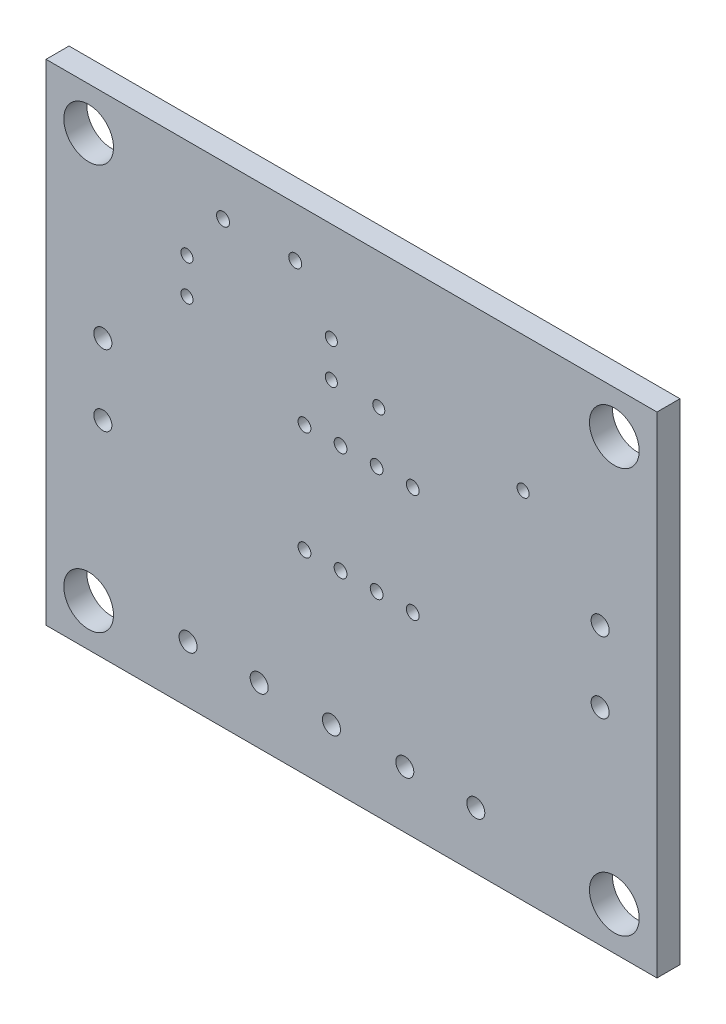
ISO-10303-21;
HEADER;
FILE_DESCRIPTION(('STEP AP214'),'2;1');
FILE_NAME('part.step','',(''),(''),'','','');
FILE_SCHEMA(('AUTOMOTIVE_DESIGN { 1 0 10303 214 1 1 1 1 }'));
ENDSEC;
DATA;
#1=APPLICATION_CONTEXT('core data for automotive mechanical design processes');
#2=APPLICATION_PROTOCOL_DEFINITION('international standard','automotive_design',2000,#1);
#3=PRODUCT_CONTEXT('',#1,'mechanical');
#4=PRODUCT('Part','Part','',(#3));
#5=PRODUCT_RELATED_PRODUCT_CATEGORY('part','',(#4));
#6=PRODUCT_DEFINITION_FORMATION('','',#4);
#7=PRODUCT_DEFINITION_CONTEXT('part definition',#1,'design');
#8=PRODUCT_DEFINITION('design','',#6,#7);
#9=PRODUCT_DEFINITION_SHAPE('','',#8);
#10=(LENGTH_UNIT() NAMED_UNIT(*) SI_UNIT(.MILLI.,.METRE.));
#11=(NAMED_UNIT(*) PLANE_ANGLE_UNIT() SI_UNIT($,.RADIAN.));
#12=(NAMED_UNIT(*) SI_UNIT($,.STERADIAN.) SOLID_ANGLE_UNIT());
#13=UNCERTAINTY_MEASURE_WITH_UNIT(LENGTH_MEASURE(1.E-05),#10,'distance_accuracy_value','');
#14=(GEOMETRIC_REPRESENTATION_CONTEXT(3) GLOBAL_UNCERTAINTY_ASSIGNED_CONTEXT((#13)) GLOBAL_UNIT_ASSIGNED_CONTEXT((#10,
#11,#12)) REPRESENTATION_CONTEXT('',''));
#15=CARTESIAN_POINT('',(0.,0.,0.));
#16=DIRECTION('',(0.,0.,1.));
#17=DIRECTION('',(1.,0.,0.));
#18=AXIS2_PLACEMENT_3D('',#15,#16,#17);
#19=CARTESIAN_POINT('',(0.,0.,0.));
#20=DIRECTION('',(0.,0.,-1.));
#21=DIRECTION('',(-1.,0.,0.));
#22=AXIS2_PLACEMENT_3D('',#19,#20,#21);
#23=PLANE('',#22);
#24=CARTESIAN_POINT('',(40.00000128,31.5000005,0.));
#25=DIRECTION('',(0.,0.,-1.));
#26=DIRECTION('',(-1.,0.,0.));
#27=AXIS2_PLACEMENT_3D('',#24,#25,#26);
#28=CIRCLE('',#27,1.74999904);
#29=CARTESIAN_POINT('',(38.25000224,31.5000005,0.));
#30=VERTEX_POINT('',#29);
#31=EDGE_CURVE('E163',#30,#30,#28,.F.);
#32=ORIENTED_EDGE('',*,*,#31,.T.);
#33=EDGE_LOOP('',(#32));
#34=FACE_BOUND('',#33,.T.);
#35=CARTESIAN_POINT('',(33.57999888,25.0000008,0.));
#36=DIRECTION('',(0.,0.,-1.));
#37=DIRECTION('',(-1.,0.,0.));
#38=AXIS2_PLACEMENT_3D('',#35,#36,#37);
#39=CIRCLE('',#38,0.42500042);
#40=CARTESIAN_POINT('',(33.15499846,25.0000008,0.));
#41=VERTEX_POINT('',#40);
#42=EDGE_CURVE('E166',#41,#41,#39,.F.);
#43=ORIENTED_EDGE('',*,*,#42,.T.);
#44=EDGE_LOOP('',(#43));
#45=FACE_BOUND('',#44,.T.);
#46=CARTESIAN_POINT('',(39.00000074,19.4999991,0.));
#47=DIRECTION('',(0.,0.,-1.));
#48=DIRECTION('',(-1.,0.,0.));
#49=AXIS2_PLACEMENT_3D('',#46,#47,#48);
#50=CIRCLE('',#49,0.635);
#51=CARTESIAN_POINT('',(38.36500074,19.4999991,0.));
#52=VERTEX_POINT('',#51);
#53=EDGE_CURVE('E169',#52,#52,#50,.F.);
#54=ORIENTED_EDGE('',*,*,#53,.T.);
#55=EDGE_LOOP('',(#54));
#56=FACE_BOUND('',#55,.T.);
#57=CARTESIAN_POINT('',(25.80999918,21.31000056,0.));
#58=DIRECTION('',(0.,0.,-1.));
#59=DIRECTION('',(-1.,0.,0.));
#60=AXIS2_PLACEMENT_3D('',#57,#58,#59);
#61=CIRCLE('',#60,0.4499991);
#62=CARTESIAN_POINT('',(25.36000008,21.31000056,0.));
#63=VERTEX_POINT('',#62);
#64=EDGE_CURVE('E172',#63,#63,#61,.F.);
#65=ORIENTED_EDGE('',*,*,#64,.T.);
#66=EDGE_LOOP('',(#65));
#67=FACE_BOUND('',#66,.T.);
#68=CARTESIAN_POINT('',(23.41999888,25.0000008,0.));
#69=DIRECTION('',(0.,0.,-1.));
#70=DIRECTION('',(-1.,0.,0.));
#71=AXIS2_PLACEMENT_3D('',#68,#69,#70);
#72=CIRCLE('',#71,0.42500042);
#73=CARTESIAN_POINT('',(22.99499846,25.0000008,0.));
#74=VERTEX_POINT('',#73);
#75=EDGE_CURVE('E175',#74,#74,#72,.F.);
#76=ORIENTED_EDGE('',*,*,#75,.T.);
#77=EDGE_LOOP('',(#76));
#78=FACE_BOUND('',#77,.T.);
#79=CARTESIAN_POINT('',(20.08000048,25.0000008,0.));
#80=DIRECTION('',(0.,0.,-1.));
#81=DIRECTION('',(-1.,0.,0.));
#82=AXIS2_PLACEMENT_3D('',#79,#80,#81);
#83=CIRCLE('',#82,0.42500042);
#84=CARTESIAN_POINT('',(19.65500006,25.0000008,0.));
#85=VERTEX_POINT('',#84);
#86=EDGE_CURVE('E178',#85,#85,#83,.F.);
#87=ORIENTED_EDGE('',*,*,#86,.T.);
#88=EDGE_LOOP('',(#87));
#89=FACE_BOUND('',#88,.T.);
#90=CARTESIAN_POINT('',(23.26999918,21.31000056,0.));
#91=DIRECTION('',(0.,0.,-1.));
#92=DIRECTION('',(-1.,0.,0.));
#93=AXIS2_PLACEMENT_3D('',#90,#91,#92);
#94=CIRCLE('',#93,0.4499991);
#95=CARTESIAN_POINT('',(22.82000008,21.31000056,0.));
#96=VERTEX_POINT('',#95);
#97=EDGE_CURVE('E181',#96,#96,#94,.F.);
#98=ORIENTED_EDGE('',*,*,#97,.T.);
#99=EDGE_LOOP('',(#98));
#100=FACE_BOUND('',#99,.T.);
#101=CARTESIAN_POINT('',(20.72999918,21.31000056,0.));
#102=DIRECTION('',(0.,0.,-1.));
#103=DIRECTION('',(-1.,0.,0.));
#104=AXIS2_PLACEMENT_3D('',#101,#102,#103);
#105=CIRCLE('',#104,0.4499991);
#106=CARTESIAN_POINT('',(20.28000008,21.31000056,0.));
#107=VERTEX_POINT('',#106);
#108=EDGE_CURVE('E184',#107,#107,#105,.F.);
#109=ORIENTED_EDGE('',*,*,#108,.T.);
#110=EDGE_LOOP('',(#109));
#111=FACE_BOUND('',#110,.T.);
#112=CARTESIAN_POINT('',(39.00000074,14.5000091,0.));
#113=DIRECTION('',(0.,0.,-1.));
#114=DIRECTION('',(-1.,0.,0.));
#115=AXIS2_PLACEMENT_3D('',#112,#113,#114);
#116=CIRCLE('',#115,0.635);
#117=CARTESIAN_POINT('',(38.36500074,14.5000091,0.));
#118=VERTEX_POINT('',#117);
#119=EDGE_CURVE('E187',#118,#118,#116,.F.);
#120=ORIENTED_EDGE('',*,*,#119,.T.);
#121=EDGE_LOOP('',(#120));
#122=FACE_BOUND('',#121,.T.);
#123=CARTESIAN_POINT('',(25.80999918,13.69000056,0.));
#124=DIRECTION('',(0.,0.,-1.));
#125=DIRECTION('',(-1.,0.,0.));
#126=AXIS2_PLACEMENT_3D('',#123,#124,#125);
#127=CIRCLE('',#126,0.4499991);
#128=CARTESIAN_POINT('',(25.36000008,13.69000056,0.));
#129=VERTEX_POINT('',#128);
#130=EDGE_CURVE('E190',#129,#129,#127,.F.);
#131=ORIENTED_EDGE('',*,*,#130,.T.);
#132=EDGE_LOOP('',(#131));
#133=FACE_BOUND('',#132,.T.);
#134=CARTESIAN_POINT('',(40.00000128,2.99999908,0.));
#135=DIRECTION('',(0.,0.,-1.));
#136=DIRECTION('',(-1.,0.,0.));
#137=AXIS2_PLACEMENT_3D('',#134,#135,#136);
#138=CIRCLE('',#137,1.74999904);
#139=CARTESIAN_POINT('',(38.25000224,2.99999908,0.));
#140=VERTEX_POINT('',#139);
#141=EDGE_CURVE('E193',#140,#140,#138,.F.);
#142=ORIENTED_EDGE('',*,*,#141,.T.);
#143=EDGE_LOOP('',(#142));
#144=FACE_BOUND('',#143,.T.);
#145=CARTESIAN_POINT('',(30.25000046,3.99999962,0.));
#146=DIRECTION('',(0.,0.,-1.));
#147=DIRECTION('',(-1.,0.,0.));
#148=AXIS2_PLACEMENT_3D('',#145,#146,#147);
#149=CIRCLE('',#148,0.635);
#150=CARTESIAN_POINT('',(29.61500046,3.99999962,0.));
#151=VERTEX_POINT('',#150);
#152=EDGE_CURVE('E196',#151,#151,#149,.F.);
#153=ORIENTED_EDGE('',*,*,#152,.T.);
#154=EDGE_LOOP('',(#153));
#155=FACE_BOUND('',#154,.T.);
#156=CARTESIAN_POINT('',(23.26999918,13.69000056,0.));
#157=DIRECTION('',(0.,0.,-1.));
#158=DIRECTION('',(-1.,0.,0.));
#159=AXIS2_PLACEMENT_3D('',#156,#157,#158);
#160=CIRCLE('',#159,0.4499991);
#161=CARTESIAN_POINT('',(22.82000008,13.69000056,0.));
#162=VERTEX_POINT('',#161);
#163=EDGE_CURVE('E199',#162,#162,#160,.F.);
#164=ORIENTED_EDGE('',*,*,#163,.T.);
#165=EDGE_LOOP('',(#164));
#166=FACE_BOUND('',#165,.T.);
#167=CARTESIAN_POINT('',(20.72999918,13.69000056,0.));
#168=DIRECTION('',(0.,0.,-1.));
#169=DIRECTION('',(-1.,0.,0.));
#170=AXIS2_PLACEMENT_3D('',#167,#168,#169);
#171=CIRCLE('',#170,0.4499991);
#172=CARTESIAN_POINT('',(20.28000008,13.69000056,0.));
#173=VERTEX_POINT('',#172);
#174=EDGE_CURVE('E202',#173,#173,#171,.F.);
#175=ORIENTED_EDGE('',*,*,#174,.T.);
#176=EDGE_LOOP('',(#175));
#177=FACE_BOUND('',#176,.T.);
#178=CARTESIAN_POINT('',(25.25001046,3.99999962,0.));
#179=DIRECTION('',(0.,0.,-1.));
#180=DIRECTION('',(-1.,0.,0.));
#181=AXIS2_PLACEMENT_3D('',#178,#179,#180);
#182=CIRCLE('',#181,0.635);
#183=CARTESIAN_POINT('',(24.61501046,3.99999962,0.));
#184=VERTEX_POINT('',#183);
#185=EDGE_CURVE('E205',#184,#184,#182,.F.);
#186=ORIENTED_EDGE('',*,*,#185,.T.);
#187=EDGE_LOOP('',(#186));
#188=FACE_BOUND('',#187,.T.);
#189=CARTESIAN_POINT('',(17.54000048,30.99999896,0.));
#190=DIRECTION('',(0.,0.,-1.));
#191=DIRECTION('',(-1.,0.,0.));
#192=AXIS2_PLACEMENT_3D('',#189,#190,#191);
#193=CIRCLE('',#192,0.4572);
#194=CARTESIAN_POINT('',(17.08280048,30.99999896,0.));
#195=VERTEX_POINT('',#194);
#196=EDGE_CURVE('E208',#195,#195,#193,.F.);
#197=ORIENTED_EDGE('',*,*,#196,.T.);
#198=EDGE_LOOP('',(#197));
#199=FACE_BOUND('',#198,.T.);
#200=CARTESIAN_POINT('',(12.46000048,30.99999896,0.));
#201=DIRECTION('',(0.,0.,-1.));
#202=DIRECTION('',(-1.,0.,0.));
#203=AXIS2_PLACEMENT_3D('',#200,#201,#202);
#204=CIRCLE('',#203,0.4572);
#205=CARTESIAN_POINT('',(12.00280048,30.99999896,0.));
#206=VERTEX_POINT('',#205);
#207=EDGE_CURVE('E211',#206,#206,#204,.F.);
#208=ORIENTED_EDGE('',*,*,#207,.T.);
#209=EDGE_LOOP('',(#208));
#210=FACE_BOUND('',#209,.T.);
#211=CARTESIAN_POINT('',(20.08000048,27.50000088,0.));
#212=DIRECTION('',(0.,0.,-1.));
#213=DIRECTION('',(-1.,0.,0.));
#214=AXIS2_PLACEMENT_3D('',#211,#212,#213);
#215=CIRCLE('',#214,0.42500042);
#216=CARTESIAN_POINT('',(19.65500006,27.50000088,0.));
#217=VERTEX_POINT('',#216);
#218=EDGE_CURVE('E214',#217,#217,#215,.F.);
#219=ORIENTED_EDGE('',*,*,#218,.T.);
#220=EDGE_LOOP('',(#219));
#221=FACE_BOUND('',#220,.T.);
#222=CARTESIAN_POINT('',(18.18999918,21.31000056,0.));
#223=DIRECTION('',(0.,0.,-1.));
#224=DIRECTION('',(-1.,0.,0.));
#225=AXIS2_PLACEMENT_3D('',#222,#223,#224);
#226=CIRCLE('',#225,0.4499991);
#227=CARTESIAN_POINT('',(17.74000008,21.31000056,0.));
#228=VERTEX_POINT('',#227);
#229=EDGE_CURVE('E217',#228,#228,#226,.F.);
#230=ORIENTED_EDGE('',*,*,#229,.T.);
#231=EDGE_LOOP('',(#230));
#232=FACE_BOUND('',#231,.T.);
#233=CARTESIAN_POINT('',(9.92000048,27.50000088,0.));
#234=DIRECTION('',(0.,0.,-1.));
#235=DIRECTION('',(-1.,0.,0.));
#236=AXIS2_PLACEMENT_3D('',#233,#234,#235);
#237=CIRCLE('',#236,0.42500042);
#238=CARTESIAN_POINT('',(9.49500006,27.50000088,0.));
#239=VERTEX_POINT('',#238);
#240=EDGE_CURVE('E220',#239,#239,#237,.F.);
#241=ORIENTED_EDGE('',*,*,#240,.T.);
#242=EDGE_LOOP('',(#241));
#243=FACE_BOUND('',#242,.T.);
#244=CARTESIAN_POINT('',(2.99999908,31.5000005,0.));
#245=DIRECTION('',(0.,0.,-1.));
#246=DIRECTION('',(-1.,0.,0.));
#247=AXIS2_PLACEMENT_3D('',#244,#245,#246);
#248=CIRCLE('',#247,1.74999904);
#249=CARTESIAN_POINT('',(1.25000004,31.5000005,0.));
#250=VERTEX_POINT('',#249);
#251=EDGE_CURVE('E223',#250,#250,#248,.F.);
#252=ORIENTED_EDGE('',*,*,#251,.T.);
#253=EDGE_LOOP('',(#252));
#254=FACE_BOUND('',#253,.T.);
#255=CARTESIAN_POINT('',(9.92000048,25.0000008,0.));
#256=DIRECTION('',(0.,0.,-1.));
#257=DIRECTION('',(-1.,0.,0.));
#258=AXIS2_PLACEMENT_3D('',#255,#256,#257);
#259=CIRCLE('',#258,0.42500042);
#260=CARTESIAN_POINT('',(9.49500006,25.0000008,0.));
#261=VERTEX_POINT('',#260);
#262=EDGE_CURVE('E226',#261,#261,#259,.F.);
#263=ORIENTED_EDGE('',*,*,#262,.T.);
#264=EDGE_LOOP('',(#263));
#265=FACE_BOUND('',#264,.T.);
#266=CARTESIAN_POINT('',(20.09000046,3.99999962,0.));
#267=DIRECTION('',(0.,0.,-1.));
#268=DIRECTION('',(-1.,0.,0.));
#269=AXIS2_PLACEMENT_3D('',#266,#267,#268);
#270=CIRCLE('',#269,0.635);
#271=CARTESIAN_POINT('',(19.45500046,3.99999962,0.));
#272=VERTEX_POINT('',#271);
#273=EDGE_CURVE('E229',#272,#272,#270,.F.);
#274=ORIENTED_EDGE('',*,*,#273,.T.);
#275=EDGE_LOOP('',(#274));
#276=FACE_BOUND('',#275,.T.);
#277=CARTESIAN_POINT('',(18.18999918,13.69000056,0.));
#278=DIRECTION('',(0.,0.,-1.));
#279=DIRECTION('',(-1.,0.,0.));
#280=AXIS2_PLACEMENT_3D('',#277,#278,#279);
#281=CIRCLE('',#280,0.4499991);
#282=CARTESIAN_POINT('',(17.74000008,13.69000056,0.));
#283=VERTEX_POINT('',#282);
#284=EDGE_CURVE('E232',#283,#283,#281,.F.);
#285=ORIENTED_EDGE('',*,*,#284,.T.);
#286=EDGE_LOOP('',(#285));
#287=FACE_BOUND('',#286,.T.);
#288=CARTESIAN_POINT('',(15.00000048,3.99999962,0.));
#289=DIRECTION('',(0.,0.,-1.));
#290=DIRECTION('',(-1.,0.,0.));
#291=AXIS2_PLACEMENT_3D('',#288,#289,#290);
#292=CIRCLE('',#291,0.635);
#293=CARTESIAN_POINT('',(14.36500048,3.99999962,0.));
#294=VERTEX_POINT('',#293);
#295=EDGE_CURVE('E235',#294,#294,#292,.F.);
#296=ORIENTED_EDGE('',*,*,#295,.T.);
#297=EDGE_LOOP('',(#296));
#298=FACE_BOUND('',#297,.T.);
#299=CARTESIAN_POINT('',(10.00001048,3.99999962,0.));
#300=DIRECTION('',(0.,0.,-1.));
#301=DIRECTION('',(-1.,0.,0.));
#302=AXIS2_PLACEMENT_3D('',#299,#300,#301);
#303=CIRCLE('',#302,0.635);
#304=CARTESIAN_POINT('',(9.36501048,3.99999962,0.));
#305=VERTEX_POINT('',#304);
#306=EDGE_CURVE('E238',#305,#305,#303,.F.);
#307=ORIENTED_EDGE('',*,*,#306,.T.);
#308=EDGE_LOOP('',(#307));
#309=FACE_BOUND('',#308,.T.);
#310=CARTESIAN_POINT('',(3.99999962,14.49999894,0.));
#311=DIRECTION('',(0.,0.,-1.));
#312=DIRECTION('',(-1.,0.,0.));
#313=AXIS2_PLACEMENT_3D('',#310,#311,#312);
#314=CIRCLE('',#313,0.635);
#315=CARTESIAN_POINT('',(3.36499962,14.49999894,0.));
#316=VERTEX_POINT('',#315);
#317=EDGE_CURVE('E241',#316,#316,#314,.F.);
#318=ORIENTED_EDGE('',*,*,#317,.T.);
#319=EDGE_LOOP('',(#318));
#320=FACE_BOUND('',#319,.T.);
#321=CARTESIAN_POINT('',(3.99999962,19.49998894,0.));
#322=DIRECTION('',(0.,0.,-1.));
#323=DIRECTION('',(-1.,0.,0.));
#324=AXIS2_PLACEMENT_3D('',#321,#322,#323);
#325=CIRCLE('',#324,0.635);
#326=CARTESIAN_POINT('',(3.36499962,19.49998894,0.));
#327=VERTEX_POINT('',#326);
#328=EDGE_CURVE('E243',#327,#327,#325,.F.);
#329=ORIENTED_EDGE('',*,*,#328,.T.);
#330=EDGE_LOOP('',(#329));
#331=FACE_BOUND('',#330,.T.);
#332=CARTESIAN_POINT('',(2.99999908,2.99999908,0.));
#333=DIRECTION('',(0.,0.,-1.));
#334=DIRECTION('',(-1.,0.,0.));
#335=AXIS2_PLACEMENT_3D('',#332,#333,#334);
#336=CIRCLE('',#335,1.74999904);
#337=CARTESIAN_POINT('',(1.25000004,2.99999908,0.));
#338=VERTEX_POINT('',#337);
#339=EDGE_CURVE('E19',#338,#338,#336,.F.);
#340=ORIENTED_EDGE('',*,*,#339,.T.);
#341=EDGE_LOOP('',(#340));
#342=FACE_BOUND('',#341,.T.);
#343=DIRECTION('',(0.,1.,0.));
#344=VECTOR('',#343,1.);
#345=CARTESIAN_POINT('',(43.00000036,0.,0.));
#346=LINE('',#345,#344);
#347=CARTESIAN_POINT('',(43.00000036,34.49999958,0.));
#348=VERTEX_POINT('',#347);
#349=CARTESIAN_POINT('',(43.00000036,0.,0.));
#350=VERTEX_POINT('',#349);
#351=EDGE_CURVE('E257',#348,#350,#346,.F.);
#352=ORIENTED_EDGE('',*,*,#351,.T.);
#353=DIRECTION('',(1.,0.,0.));
#354=VECTOR('',#353,1.);
#355=CARTESIAN_POINT('',(0.,0.,0.));
#356=LINE('',#355,#354);
#357=CARTESIAN_POINT('',(0.,0.,0.));
#358=VERTEX_POINT('',#357);
#359=EDGE_CURVE('E59',#350,#358,#356,.F.);
#360=ORIENTED_EDGE('',*,*,#359,.T.);
#361=DIRECTION('',(0.,1.,0.));
#362=VECTOR('',#361,1.);
#363=CARTESIAN_POINT('',(0.,34.49999958,0.));
#364=LINE('',#363,#362);
#365=CARTESIAN_POINT('',(0.,34.49999958,0.));
#366=VERTEX_POINT('',#365);
#367=EDGE_CURVE('E58',#358,#366,#364,.T.);
#368=ORIENTED_EDGE('',*,*,#367,.T.);
#369=DIRECTION('',(1.,0.,0.));
#370=VECTOR('',#369,1.);
#371=CARTESIAN_POINT('',(43.00000036,34.49999958,0.));
#372=LINE('',#371,#370);
#373=EDGE_CURVE('E55',#366,#348,#372,.T.);
#374=ORIENTED_EDGE('',*,*,#373,.T.);
#375=EDGE_LOOP('',(#352,#360,#368,#374));
#376=FACE_BOUND('',#375,.T.);
#377=ADVANCED_FACE('F16',(#34,#45,#56,#67,#78,#89,#100,#111,#122,#133,#144,#155,#166,#177,#188,
#199,#210,#221,#232,#243,#254,#265,#276,#287,#298,#309,#320,#331,#342,#376),#23,.T.);
#378=CARTESIAN_POINT('',(0.,34.49999958,0.));
#379=DIRECTION('',(1.,0.,0.));
#380=DIRECTION('',(0.,0.,-1.));
#381=AXIS2_PLACEMENT_3D('',#378,#379,#380);
#382=PLANE('',#381);
#383=DIRECTION('',(0.,0.,1.));
#384=VECTOR('',#383,1.);
#385=CARTESIAN_POINT('',(0.,0.,0.));
#386=LINE('',#385,#384);
#387=CARTESIAN_POINT('',(0.,0.,1.62044126));
#388=VERTEX_POINT('',#387);
#389=EDGE_CURVE('E251',#358,#388,#386,.T.);
#390=ORIENTED_EDGE('',*,*,#389,.T.);
#391=DIRECTION('',(0.,1.,0.));
#392=VECTOR('',#391,1.);
#393=CARTESIAN_POINT('',(0.,0.,1.62044126));
#394=LINE('',#393,#392);
#395=CARTESIAN_POINT('',(0.,34.49999958,1.62044126));
#396=VERTEX_POINT('',#395);
#397=EDGE_CURVE('E75',#388,#396,#394,.T.);
#398=ORIENTED_EDGE('',*,*,#397,.T.);
#399=DIRECTION('',(0.,0.,-1.));
#400=VECTOR('',#399,1.);
#401=CARTESIAN_POINT('',(0.,34.49999958,0.));
#402=LINE('',#401,#400);
#403=EDGE_CURVE('E64',#396,#366,#402,.T.);
#404=ORIENTED_EDGE('',*,*,#403,.T.);
#405=ORIENTED_EDGE('',*,*,#367,.F.);
#406=EDGE_LOOP('',(#390,#398,#404,#405));
#407=FACE_BOUND('',#406,.T.);
#408=ADVANCED_FACE('F74',(#407),#382,.F.);
#409=CARTESIAN_POINT('',(43.00000036,34.49999958,0.));
#410=DIRECTION('',(0.,-1.,0.));
#411=DIRECTION('',(0.,0.,-1.));
#412=AXIS2_PLACEMENT_3D('',#409,#410,#411);
#413=PLANE('',#412);
#414=ORIENTED_EDGE('',*,*,#403,.F.);
#415=DIRECTION('',(-1.,0.,0.));
#416=VECTOR('',#415,1.);
#417=CARTESIAN_POINT('',(0.,34.49999958,1.62044126));
#418=LINE('',#417,#416);
#419=CARTESIAN_POINT('',(43.00000036,34.49999958,1.62044126));
#420=VERTEX_POINT('',#419);
#421=EDGE_CURVE('E265',#396,#420,#418,.F.);
#422=ORIENTED_EDGE('',*,*,#421,.T.);
#423=DIRECTION('',(0.,0.,1.));
#424=VECTOR('',#423,1.);
#425=CARTESIAN_POINT('',(43.00000036,34.49999958,0.));
#426=LINE('',#425,#424);
#427=EDGE_CURVE('E71',#420,#348,#426,.F.);
#428=ORIENTED_EDGE('',*,*,#427,.T.);
#429=ORIENTED_EDGE('',*,*,#373,.F.);
#430=EDGE_LOOP('',(#414,#422,#428,#429));
#431=FACE_BOUND('',#430,.T.);
#432=ADVANCED_FACE('F68',(#431),#413,.F.);
#433=CARTESIAN_POINT('',(43.00000036,0.,0.));
#434=DIRECTION('',(-1.,0.,0.));
#435=DIRECTION('',(0.,0.,1.));
#436=AXIS2_PLACEMENT_3D('',#433,#434,#435);
#437=PLANE('',#436);
#438=ORIENTED_EDGE('',*,*,#427,.F.);
#439=DIRECTION('',(0.,1.,0.));
#440=VECTOR('',#439,1.);
#441=CARTESIAN_POINT('',(43.00000036,0.,1.62044126));
#442=LINE('',#441,#440);
#443=CARTESIAN_POINT('',(43.00000036,0.,1.62044126));
#444=VERTEX_POINT('',#443);
#445=EDGE_CURVE('E263',#420,#444,#442,.F.);
#446=ORIENTED_EDGE('',*,*,#445,.T.);
#447=DIRECTION('',(0.,0.,1.));
#448=VECTOR('',#447,1.);
#449=CARTESIAN_POINT('',(43.00000036,0.,0.));
#450=LINE('',#449,#448);
#451=EDGE_CURVE('E34',#444,#350,#450,.F.);
#452=ORIENTED_EDGE('',*,*,#451,.T.);
#453=ORIENTED_EDGE('',*,*,#351,.F.);
#454=EDGE_LOOP('',(#438,#446,#452,#453));
#455=FACE_BOUND('',#454,.T.);
#456=ADVANCED_FACE('F261',(#455),#437,.F.);
#457=CARTESIAN_POINT('',(0.,0.,0.));
#458=DIRECTION('',(0.,1.,0.));
#459=DIRECTION('',(0.,0.,1.));
#460=AXIS2_PLACEMENT_3D('',#457,#458,#459);
#461=PLANE('',#460);
#462=ORIENTED_EDGE('',*,*,#451,.F.);
#463=DIRECTION('',(-1.,0.,0.));
#464=VECTOR('',#463,1.);
#465=CARTESIAN_POINT('',(0.,0.,1.62044126));
#466=LINE('',#465,#464);
#467=EDGE_CURVE('E162',#444,#388,#466,.T.);
#468=ORIENTED_EDGE('',*,*,#467,.T.);
#469=ORIENTED_EDGE('',*,*,#389,.F.);
#470=ORIENTED_EDGE('',*,*,#359,.F.);
#471=EDGE_LOOP('',(#462,#468,#469,#470));
#472=FACE_BOUND('',#471,.T.);
#473=ADVANCED_FACE('F259',(#472),#461,.F.);
#474=CARTESIAN_POINT('',(2.99999908,2.99999908,0.));
#475=DIRECTION('',(0.,0.,-1.));
#476=DIRECTION('',(-1.,0.,0.));
#477=AXIS2_PLACEMENT_3D('',#474,#475,#476);
#478=CYLINDRICAL_SURFACE('',#477,1.74999904);
#479=CARTESIAN_POINT('',(2.99999908,2.99999908,1.62044126));
#480=DIRECTION('',(0.,0.,-1.));
#481=DIRECTION('',(-1.,0.,0.));
#482=AXIS2_PLACEMENT_3D('',#479,#480,#481);
#483=CIRCLE('',#482,1.74999904);
#484=CARTESIAN_POINT('',(1.25000004,2.99999908,1.62044126));
#485=VERTEX_POINT('',#484);
#486=EDGE_CURVE('E159',#485,#485,#483,.F.);
#487=ORIENTED_EDGE('',*,*,#486,.T.);
#488=EDGE_LOOP('',(#487));
#489=FACE_BOUND('',#488,.T.);
#490=ORIENTED_EDGE('',*,*,#339,.F.);
#491=EDGE_LOOP('',(#490));
#492=FACE_BOUND('',#491,.T.);
#493=ADVANCED_FACE('F389',(#489,#492),#478,.F.);
#494=CARTESIAN_POINT('',(3.99999962,19.49998894,0.));
#495=DIRECTION('',(0.,0.,-1.));
#496=DIRECTION('',(-1.,0.,0.));
#497=AXIS2_PLACEMENT_3D('',#494,#495,#496);
#498=CYLINDRICAL_SURFACE('',#497,0.635);
#499=CARTESIAN_POINT('',(3.99999962,19.49998894,1.62044126));
#500=DIRECTION('',(0.,0.,-1.));
#501=DIRECTION('',(-1.,0.,0.));
#502=AXIS2_PLACEMENT_3D('',#499,#500,#501);
#503=CIRCLE('',#502,0.635);
#504=CARTESIAN_POINT('',(3.36499962,19.49998894,1.62044126));
#505=VERTEX_POINT('',#504);
#506=EDGE_CURVE('E156',#505,#505,#503,.F.);
#507=ORIENTED_EDGE('',*,*,#506,.T.);
#508=EDGE_LOOP('',(#507));
#509=FACE_BOUND('',#508,.T.);
#510=ORIENTED_EDGE('',*,*,#328,.F.);
#511=EDGE_LOOP('',(#510));
#512=FACE_BOUND('',#511,.T.);
#513=ADVANCED_FACE('F385',(#509,#512),#498,.F.);
#514=CARTESIAN_POINT('',(3.99999962,14.49999894,0.));
#515=DIRECTION('',(0.,0.,-1.));
#516=DIRECTION('',(-1.,0.,0.));
#517=AXIS2_PLACEMENT_3D('',#514,#515,#516);
#518=CYLINDRICAL_SURFACE('',#517,0.635);
#519=CARTESIAN_POINT('',(3.99999962,14.49999894,1.62044126));
#520=DIRECTION('',(0.,0.,-1.));
#521=DIRECTION('',(-1.,0.,0.));
#522=AXIS2_PLACEMENT_3D('',#519,#520,#521);
#523=CIRCLE('',#522,0.635);
#524=CARTESIAN_POINT('',(3.36499962,14.49999894,1.62044126));
#525=VERTEX_POINT('',#524);
#526=EDGE_CURVE('E153',#525,#525,#523,.F.);
#527=ORIENTED_EDGE('',*,*,#526,.T.);
#528=EDGE_LOOP('',(#527));
#529=FACE_BOUND('',#528,.T.);
#530=ORIENTED_EDGE('',*,*,#317,.F.);
#531=EDGE_LOOP('',(#530));
#532=FACE_BOUND('',#531,.T.);
#533=ADVANCED_FACE('F381',(#529,#532),#518,.F.);
#534=CARTESIAN_POINT('',(10.00001048,3.99999962,0.));
#535=DIRECTION('',(0.,0.,-1.));
#536=DIRECTION('',(-1.,0.,0.));
#537=AXIS2_PLACEMENT_3D('',#534,#535,#536);
#538=CYLINDRICAL_SURFACE('',#537,0.635);
#539=CARTESIAN_POINT('',(10.00001048,3.99999962,1.62044126));
#540=DIRECTION('',(0.,0.,-1.));
#541=DIRECTION('',(-1.,0.,0.));
#542=AXIS2_PLACEMENT_3D('',#539,#540,#541);
#543=CIRCLE('',#542,0.635);
#544=CARTESIAN_POINT('',(9.36501048,3.99999962,1.62044126));
#545=VERTEX_POINT('',#544);
#546=EDGE_CURVE('E150',#545,#545,#543,.F.);
#547=ORIENTED_EDGE('',*,*,#546,.T.);
#548=EDGE_LOOP('',(#547));
#549=FACE_BOUND('',#548,.T.);
#550=ORIENTED_EDGE('',*,*,#306,.F.);
#551=EDGE_LOOP('',(#550));
#552=FACE_BOUND('',#551,.T.);
#553=ADVANCED_FACE('F377',(#549,#552),#538,.F.);
#554=CARTESIAN_POINT('',(15.00000048,3.99999962,0.));
#555=DIRECTION('',(0.,0.,-1.));
#556=DIRECTION('',(-1.,0.,0.));
#557=AXIS2_PLACEMENT_3D('',#554,#555,#556);
#558=CYLINDRICAL_SURFACE('',#557,0.635);
#559=CARTESIAN_POINT('',(15.00000048,3.99999962,1.62044126));
#560=DIRECTION('',(0.,0.,-1.));
#561=DIRECTION('',(-1.,0.,0.));
#562=AXIS2_PLACEMENT_3D('',#559,#560,#561);
#563=CIRCLE('',#562,0.635);
#564=CARTESIAN_POINT('',(14.36500048,3.99999962,1.62044126));
#565=VERTEX_POINT('',#564);
#566=EDGE_CURVE('E147',#565,#565,#563,.F.);
#567=ORIENTED_EDGE('',*,*,#566,.T.);
#568=EDGE_LOOP('',(#567));
#569=FACE_BOUND('',#568,.T.);
#570=ORIENTED_EDGE('',*,*,#295,.F.);
#571=EDGE_LOOP('',(#570));
#572=FACE_BOUND('',#571,.T.);
#573=ADVANCED_FACE('F373',(#569,#572),#558,.F.);
#574=CARTESIAN_POINT('',(18.18999918,13.69000056,0.));
#575=DIRECTION('',(0.,0.,-1.));
#576=DIRECTION('',(-1.,0.,0.));
#577=AXIS2_PLACEMENT_3D('',#574,#575,#576);
#578=CYLINDRICAL_SURFACE('',#577,0.4499991);
#579=CARTESIAN_POINT('',(18.18999918,13.69000056,1.62044126));
#580=DIRECTION('',(0.,0.,-1.));
#581=DIRECTION('',(-1.,0.,0.));
#582=AXIS2_PLACEMENT_3D('',#579,#580,#581);
#583=CIRCLE('',#582,0.4499991);
#584=CARTESIAN_POINT('',(17.74000008,13.69000056,1.62044126));
#585=VERTEX_POINT('',#584);
#586=EDGE_CURVE('E144',#585,#585,#583,.F.);
#587=ORIENTED_EDGE('',*,*,#586,.T.);
#588=EDGE_LOOP('',(#587));
#589=FACE_BOUND('',#588,.T.);
#590=ORIENTED_EDGE('',*,*,#284,.F.);
#591=EDGE_LOOP('',(#590));
#592=FACE_BOUND('',#591,.T.);
#593=ADVANCED_FACE('F369',(#589,#592),#578,.F.);
#594=CARTESIAN_POINT('',(20.09000046,3.99999962,0.));
#595=DIRECTION('',(0.,0.,-1.));
#596=DIRECTION('',(-1.,0.,0.));
#597=AXIS2_PLACEMENT_3D('',#594,#595,#596);
#598=CYLINDRICAL_SURFACE('',#597,0.635);
#599=CARTESIAN_POINT('',(20.09000046,3.99999962,1.62044126));
#600=DIRECTION('',(0.,0.,-1.));
#601=DIRECTION('',(-1.,0.,0.));
#602=AXIS2_PLACEMENT_3D('',#599,#600,#601);
#603=CIRCLE('',#602,0.635);
#604=CARTESIAN_POINT('',(19.45500046,3.99999962,1.62044126));
#605=VERTEX_POINT('',#604);
#606=EDGE_CURVE('E141',#605,#605,#603,.F.);
#607=ORIENTED_EDGE('',*,*,#606,.T.);
#608=EDGE_LOOP('',(#607));
#609=FACE_BOUND('',#608,.T.);
#610=ORIENTED_EDGE('',*,*,#273,.F.);
#611=EDGE_LOOP('',(#610));
#612=FACE_BOUND('',#611,.T.);
#613=ADVANCED_FACE('F365',(#609,#612),#598,.F.);
#614=CARTESIAN_POINT('',(9.92000048,25.0000008,0.));
#615=DIRECTION('',(0.,0.,-1.));
#616=DIRECTION('',(-1.,0.,0.));
#617=AXIS2_PLACEMENT_3D('',#614,#615,#616);
#618=CYLINDRICAL_SURFACE('',#617,0.42500042);
#619=CARTESIAN_POINT('',(9.92000048,25.0000008,1.62044126));
#620=DIRECTION('',(0.,0.,-1.));
#621=DIRECTION('',(-1.,0.,0.));
#622=AXIS2_PLACEMENT_3D('',#619,#620,#621);
#623=CIRCLE('',#622,0.42500042);
#624=CARTESIAN_POINT('',(9.49500006,25.0000008,1.62044126));
#625=VERTEX_POINT('',#624);
#626=EDGE_CURVE('E138',#625,#625,#623,.F.);
#627=ORIENTED_EDGE('',*,*,#626,.T.);
#628=EDGE_LOOP('',(#627));
#629=FACE_BOUND('',#628,.T.);
#630=ORIENTED_EDGE('',*,*,#262,.F.);
#631=EDGE_LOOP('',(#630));
#632=FACE_BOUND('',#631,.T.);
#633=ADVANCED_FACE('F361',(#629,#632),#618,.F.);
#634=CARTESIAN_POINT('',(2.99999908,31.5000005,0.));
#635=DIRECTION('',(0.,0.,-1.));
#636=DIRECTION('',(-1.,0.,0.));
#637=AXIS2_PLACEMENT_3D('',#634,#635,#636);
#638=CYLINDRICAL_SURFACE('',#637,1.74999904);
#639=CARTESIAN_POINT('',(2.99999908,31.5000005,1.62044126));
#640=DIRECTION('',(0.,0.,-1.));
#641=DIRECTION('',(-1.,0.,0.));
#642=AXIS2_PLACEMENT_3D('',#639,#640,#641);
#643=CIRCLE('',#642,1.74999904);
#644=CARTESIAN_POINT('',(1.25000004,31.5000005,1.62044126));
#645=VERTEX_POINT('',#644);
#646=EDGE_CURVE('E135',#645,#645,#643,.F.);
#647=ORIENTED_EDGE('',*,*,#646,.T.);
#648=EDGE_LOOP('',(#647));
#649=FACE_BOUND('',#648,.T.);
#650=ORIENTED_EDGE('',*,*,#251,.F.);
#651=EDGE_LOOP('',(#650));
#652=FACE_BOUND('',#651,.T.);
#653=ADVANCED_FACE('F357',(#649,#652),#638,.F.);
#654=CARTESIAN_POINT('',(9.92000048,27.50000088,0.));
#655=DIRECTION('',(0.,0.,-1.));
#656=DIRECTION('',(-1.,0.,0.));
#657=AXIS2_PLACEMENT_3D('',#654,#655,#656);
#658=CYLINDRICAL_SURFACE('',#657,0.42500042);
#659=CARTESIAN_POINT('',(9.92000048,27.50000088,1.62044126));
#660=DIRECTION('',(0.,0.,-1.));
#661=DIRECTION('',(-1.,0.,0.));
#662=AXIS2_PLACEMENT_3D('',#659,#660,#661);
#663=CIRCLE('',#662,0.42500042);
#664=CARTESIAN_POINT('',(9.49500006,27.50000088,1.62044126));
#665=VERTEX_POINT('',#664);
#666=EDGE_CURVE('E132',#665,#665,#663,.F.);
#667=ORIENTED_EDGE('',*,*,#666,.T.);
#668=EDGE_LOOP('',(#667));
#669=FACE_BOUND('',#668,.T.);
#670=ORIENTED_EDGE('',*,*,#240,.F.);
#671=EDGE_LOOP('',(#670));
#672=FACE_BOUND('',#671,.T.);
#673=ADVANCED_FACE('F353',(#669,#672),#658,.F.);
#674=CARTESIAN_POINT('',(18.18999918,21.31000056,0.));
#675=DIRECTION('',(0.,0.,-1.));
#676=DIRECTION('',(-1.,0.,0.));
#677=AXIS2_PLACEMENT_3D('',#674,#675,#676);
#678=CYLINDRICAL_SURFACE('',#677,0.4499991);
#679=CARTESIAN_POINT('',(18.18999918,21.31000056,1.62044126));
#680=DIRECTION('',(0.,0.,-1.));
#681=DIRECTION('',(-1.,0.,0.));
#682=AXIS2_PLACEMENT_3D('',#679,#680,#681);
#683=CIRCLE('',#682,0.4499991);
#684=CARTESIAN_POINT('',(17.74000008,21.31000056,1.62044126));
#685=VERTEX_POINT('',#684);
#686=EDGE_CURVE('E129',#685,#685,#683,.F.);
#687=ORIENTED_EDGE('',*,*,#686,.T.);
#688=EDGE_LOOP('',(#687));
#689=FACE_BOUND('',#688,.T.);
#690=ORIENTED_EDGE('',*,*,#229,.F.);
#691=EDGE_LOOP('',(#690));
#692=FACE_BOUND('',#691,.T.);
#693=ADVANCED_FACE('F349',(#689,#692),#678,.F.);
#694=CARTESIAN_POINT('',(20.08000048,27.50000088,0.));
#695=DIRECTION('',(0.,0.,-1.));
#696=DIRECTION('',(-1.,0.,0.));
#697=AXIS2_PLACEMENT_3D('',#694,#695,#696);
#698=CYLINDRICAL_SURFACE('',#697,0.42500042);
#699=CARTESIAN_POINT('',(20.08000048,27.50000088,1.62044126));
#700=DIRECTION('',(0.,0.,-1.));
#701=DIRECTION('',(-1.,0.,0.));
#702=AXIS2_PLACEMENT_3D('',#699,#700,#701);
#703=CIRCLE('',#702,0.42500042);
#704=CARTESIAN_POINT('',(19.65500006,27.50000088,1.62044126));
#705=VERTEX_POINT('',#704);
#706=EDGE_CURVE('E126',#705,#705,#703,.F.);
#707=ORIENTED_EDGE('',*,*,#706,.T.);
#708=EDGE_LOOP('',(#707));
#709=FACE_BOUND('',#708,.T.);
#710=ORIENTED_EDGE('',*,*,#218,.F.);
#711=EDGE_LOOP('',(#710));
#712=FACE_BOUND('',#711,.T.);
#713=ADVANCED_FACE('F345',(#709,#712),#698,.F.);
#714=CARTESIAN_POINT('',(12.46000048,30.99999896,0.));
#715=DIRECTION('',(0.,0.,-1.));
#716=DIRECTION('',(-1.,0.,0.));
#717=AXIS2_PLACEMENT_3D('',#714,#715,#716);
#718=CYLINDRICAL_SURFACE('',#717,0.4572);
#719=CARTESIAN_POINT('',(12.46000048,30.99999896,1.62044126));
#720=DIRECTION('',(0.,0.,-1.));
#721=DIRECTION('',(-1.,0.,0.));
#722=AXIS2_PLACEMENT_3D('',#719,#720,#721);
#723=CIRCLE('',#722,0.4572);
#724=CARTESIAN_POINT('',(12.00280048,30.99999896,1.62044126));
#725=VERTEX_POINT('',#724);
#726=EDGE_CURVE('E123',#725,#725,#723,.F.);
#727=ORIENTED_EDGE('',*,*,#726,.T.);
#728=EDGE_LOOP('',(#727));
#729=FACE_BOUND('',#728,.T.);
#730=ORIENTED_EDGE('',*,*,#207,.F.);
#731=EDGE_LOOP('',(#730));
#732=FACE_BOUND('',#731,.T.);
#733=ADVANCED_FACE('F341',(#729,#732),#718,.F.);
#734=CARTESIAN_POINT('',(17.54000048,30.99999896,0.));
#735=DIRECTION('',(0.,0.,-1.));
#736=DIRECTION('',(-1.,0.,0.));
#737=AXIS2_PLACEMENT_3D('',#734,#735,#736);
#738=CYLINDRICAL_SURFACE('',#737,0.4572);
#739=CARTESIAN_POINT('',(17.54000048,30.99999896,1.62044126));
#740=DIRECTION('',(0.,0.,-1.));
#741=DIRECTION('',(-1.,0.,0.));
#742=AXIS2_PLACEMENT_3D('',#739,#740,#741);
#743=CIRCLE('',#742,0.4572);
#744=CARTESIAN_POINT('',(17.08280048,30.99999896,1.62044126));
#745=VERTEX_POINT('',#744);
#746=EDGE_CURVE('E120',#745,#745,#743,.F.);
#747=ORIENTED_EDGE('',*,*,#746,.T.);
#748=EDGE_LOOP('',(#747));
#749=FACE_BOUND('',#748,.T.);
#750=ORIENTED_EDGE('',*,*,#196,.F.);
#751=EDGE_LOOP('',(#750));
#752=FACE_BOUND('',#751,.T.);
#753=ADVANCED_FACE('F337',(#749,#752),#738,.F.);
#754=CARTESIAN_POINT('',(25.25001046,3.99999962,0.));
#755=DIRECTION('',(0.,0.,-1.));
#756=DIRECTION('',(-1.,0.,0.));
#757=AXIS2_PLACEMENT_3D('',#754,#755,#756);
#758=CYLINDRICAL_SURFACE('',#757,0.635);
#759=CARTESIAN_POINT('',(25.25001046,3.99999962,1.62044126));
#760=DIRECTION('',(0.,0.,-1.));
#761=DIRECTION('',(-1.,0.,0.));
#762=AXIS2_PLACEMENT_3D('',#759,#760,#761);
#763=CIRCLE('',#762,0.635);
#764=CARTESIAN_POINT('',(24.61501046,3.99999962,1.62044126));
#765=VERTEX_POINT('',#764);
#766=EDGE_CURVE('E117',#765,#765,#763,.F.);
#767=ORIENTED_EDGE('',*,*,#766,.T.);
#768=EDGE_LOOP('',(#767));
#769=FACE_BOUND('',#768,.T.);
#770=ORIENTED_EDGE('',*,*,#185,.F.);
#771=EDGE_LOOP('',(#770));
#772=FACE_BOUND('',#771,.T.);
#773=ADVANCED_FACE('F333',(#769,#772),#758,.F.);
#774=CARTESIAN_POINT('',(20.72999918,13.69000056,0.));
#775=DIRECTION('',(0.,0.,-1.));
#776=DIRECTION('',(-1.,0.,0.));
#777=AXIS2_PLACEMENT_3D('',#774,#775,#776);
#778=CYLINDRICAL_SURFACE('',#777,0.4499991);
#779=CARTESIAN_POINT('',(20.72999918,13.69000056,1.62044126));
#780=DIRECTION('',(0.,0.,-1.));
#781=DIRECTION('',(-1.,0.,0.));
#782=AXIS2_PLACEMENT_3D('',#779,#780,#781);
#783=CIRCLE('',#782,0.4499991);
#784=CARTESIAN_POINT('',(20.28000008,13.69000056,1.62044126));
#785=VERTEX_POINT('',#784);
#786=EDGE_CURVE('E114',#785,#785,#783,.F.);
#787=ORIENTED_EDGE('',*,*,#786,.T.);
#788=EDGE_LOOP('',(#787));
#789=FACE_BOUND('',#788,.T.);
#790=ORIENTED_EDGE('',*,*,#174,.F.);
#791=EDGE_LOOP('',(#790));
#792=FACE_BOUND('',#791,.T.);
#793=ADVANCED_FACE('F329',(#789,#792),#778,.F.);
#794=CARTESIAN_POINT('',(23.26999918,13.69000056,0.));
#795=DIRECTION('',(0.,0.,-1.));
#796=DIRECTION('',(-1.,0.,0.));
#797=AXIS2_PLACEMENT_3D('',#794,#795,#796);
#798=CYLINDRICAL_SURFACE('',#797,0.4499991);
#799=CARTESIAN_POINT('',(23.26999918,13.69000056,1.62044126));
#800=DIRECTION('',(0.,0.,-1.));
#801=DIRECTION('',(-1.,0.,0.));
#802=AXIS2_PLACEMENT_3D('',#799,#800,#801);
#803=CIRCLE('',#802,0.4499991);
#804=CARTESIAN_POINT('',(22.82000008,13.69000056,1.62044126));
#805=VERTEX_POINT('',#804);
#806=EDGE_CURVE('E111',#805,#805,#803,.F.);
#807=ORIENTED_EDGE('',*,*,#806,.T.);
#808=EDGE_LOOP('',(#807));
#809=FACE_BOUND('',#808,.T.);
#810=ORIENTED_EDGE('',*,*,#163,.F.);
#811=EDGE_LOOP('',(#810));
#812=FACE_BOUND('',#811,.T.);
#813=ADVANCED_FACE('F325',(#809,#812),#798,.F.);
#814=CARTESIAN_POINT('',(30.25000046,3.99999962,0.));
#815=DIRECTION('',(0.,0.,-1.));
#816=DIRECTION('',(-1.,0.,0.));
#817=AXIS2_PLACEMENT_3D('',#814,#815,#816);
#818=CYLINDRICAL_SURFACE('',#817,0.635);
#819=CARTESIAN_POINT('',(30.25000046,3.99999962,1.62044126));
#820=DIRECTION('',(0.,0.,-1.));
#821=DIRECTION('',(-1.,0.,0.));
#822=AXIS2_PLACEMENT_3D('',#819,#820,#821);
#823=CIRCLE('',#822,0.635);
#824=CARTESIAN_POINT('',(29.61500046,3.99999962,1.62044126));
#825=VERTEX_POINT('',#824);
#826=EDGE_CURVE('E108',#825,#825,#823,.F.);
#827=ORIENTED_EDGE('',*,*,#826,.T.);
#828=EDGE_LOOP('',(#827));
#829=FACE_BOUND('',#828,.T.);
#830=ORIENTED_EDGE('',*,*,#152,.F.);
#831=EDGE_LOOP('',(#830));
#832=FACE_BOUND('',#831,.T.);
#833=ADVANCED_FACE('F321',(#829,#832),#818,.F.);
#834=CARTESIAN_POINT('',(40.00000128,2.99999908,0.));
#835=DIRECTION('',(0.,0.,-1.));
#836=DIRECTION('',(-1.,0.,0.));
#837=AXIS2_PLACEMENT_3D('',#834,#835,#836);
#838=CYLINDRICAL_SURFACE('',#837,1.74999904);
#839=CARTESIAN_POINT('',(40.00000128,2.99999908,1.62044126));
#840=DIRECTION('',(0.,0.,-1.));
#841=DIRECTION('',(-1.,0.,0.));
#842=AXIS2_PLACEMENT_3D('',#839,#840,#841);
#843=CIRCLE('',#842,1.74999904);
#844=CARTESIAN_POINT('',(38.25000224,2.99999908,1.62044126));
#845=VERTEX_POINT('',#844);
#846=EDGE_CURVE('E105',#845,#845,#843,.F.);
#847=ORIENTED_EDGE('',*,*,#846,.T.);
#848=EDGE_LOOP('',(#847));
#849=FACE_BOUND('',#848,.T.);
#850=ORIENTED_EDGE('',*,*,#141,.F.);
#851=EDGE_LOOP('',(#850));
#852=FACE_BOUND('',#851,.T.);
#853=ADVANCED_FACE('F317',(#849,#852),#838,.F.);
#854=CARTESIAN_POINT('',(25.80999918,13.69000056,0.));
#855=DIRECTION('',(0.,0.,-1.));
#856=DIRECTION('',(-1.,0.,0.));
#857=AXIS2_PLACEMENT_3D('',#854,#855,#856);
#858=CYLINDRICAL_SURFACE('',#857,0.4499991);
#859=CARTESIAN_POINT('',(25.80999918,13.69000056,1.62044126));
#860=DIRECTION('',(0.,0.,-1.));
#861=DIRECTION('',(-1.,0.,0.));
#862=AXIS2_PLACEMENT_3D('',#859,#860,#861);
#863=CIRCLE('',#862,0.4499991);
#864=CARTESIAN_POINT('',(25.36000008,13.69000056,1.62044126));
#865=VERTEX_POINT('',#864);
#866=EDGE_CURVE('E102',#865,#865,#863,.F.);
#867=ORIENTED_EDGE('',*,*,#866,.T.);
#868=EDGE_LOOP('',(#867));
#869=FACE_BOUND('',#868,.T.);
#870=ORIENTED_EDGE('',*,*,#130,.F.);
#871=EDGE_LOOP('',(#870));
#872=FACE_BOUND('',#871,.T.);
#873=ADVANCED_FACE('F313',(#869,#872),#858,.F.);
#874=CARTESIAN_POINT('',(39.00000074,14.5000091,0.));
#875=DIRECTION('',(0.,0.,-1.));
#876=DIRECTION('',(-1.,0.,0.));
#877=AXIS2_PLACEMENT_3D('',#874,#875,#876);
#878=CYLINDRICAL_SURFACE('',#877,0.635);
#879=CARTESIAN_POINT('',(39.00000074,14.5000091,1.62044126));
#880=DIRECTION('',(0.,0.,-1.));
#881=DIRECTION('',(-1.,0.,0.));
#882=AXIS2_PLACEMENT_3D('',#879,#880,#881);
#883=CIRCLE('',#882,0.635);
#884=CARTESIAN_POINT('',(38.36500074,14.5000091,1.62044126));
#885=VERTEX_POINT('',#884);
#886=EDGE_CURVE('E99',#885,#885,#883,.F.);
#887=ORIENTED_EDGE('',*,*,#886,.T.);
#888=EDGE_LOOP('',(#887));
#889=FACE_BOUND('',#888,.T.);
#890=ORIENTED_EDGE('',*,*,#119,.F.);
#891=EDGE_LOOP('',(#890));
#892=FACE_BOUND('',#891,.T.);
#893=ADVANCED_FACE('F309',(#889,#892),#878,.F.);
#894=CARTESIAN_POINT('',(20.72999918,21.31000056,0.));
#895=DIRECTION('',(0.,0.,-1.));
#896=DIRECTION('',(-1.,0.,0.));
#897=AXIS2_PLACEMENT_3D('',#894,#895,#896);
#898=CYLINDRICAL_SURFACE('',#897,0.4499991);
#899=CARTESIAN_POINT('',(20.72999918,21.31000056,1.62044126));
#900=DIRECTION('',(0.,0.,-1.));
#901=DIRECTION('',(-1.,0.,0.));
#902=AXIS2_PLACEMENT_3D('',#899,#900,#901);
#903=CIRCLE('',#902,0.4499991);
#904=CARTESIAN_POINT('',(20.28000008,21.31000056,1.62044126));
#905=VERTEX_POINT('',#904);
#906=EDGE_CURVE('E96',#905,#905,#903,.F.);
#907=ORIENTED_EDGE('',*,*,#906,.T.);
#908=EDGE_LOOP('',(#907));
#909=FACE_BOUND('',#908,.T.);
#910=ORIENTED_EDGE('',*,*,#108,.F.);
#911=EDGE_LOOP('',(#910));
#912=FACE_BOUND('',#911,.T.);
#913=ADVANCED_FACE('F305',(#909,#912),#898,.F.);
#914=CARTESIAN_POINT('',(23.26999918,21.31000056,0.));
#915=DIRECTION('',(0.,0.,-1.));
#916=DIRECTION('',(-1.,0.,0.));
#917=AXIS2_PLACEMENT_3D('',#914,#915,#916);
#918=CYLINDRICAL_SURFACE('',#917,0.4499991);
#919=CARTESIAN_POINT('',(23.26999918,21.31000056,1.62044126));
#920=DIRECTION('',(0.,0.,-1.));
#921=DIRECTION('',(-1.,0.,0.));
#922=AXIS2_PLACEMENT_3D('',#919,#920,#921);
#923=CIRCLE('',#922,0.4499991);
#924=CARTESIAN_POINT('',(22.82000008,21.31000056,1.62044126));
#925=VERTEX_POINT('',#924);
#926=EDGE_CURVE('E93',#925,#925,#923,.F.);
#927=ORIENTED_EDGE('',*,*,#926,.T.);
#928=EDGE_LOOP('',(#927));
#929=FACE_BOUND('',#928,.T.);
#930=ORIENTED_EDGE('',*,*,#97,.F.);
#931=EDGE_LOOP('',(#930));
#932=FACE_BOUND('',#931,.T.);
#933=ADVANCED_FACE('F301',(#929,#932),#918,.F.);
#934=CARTESIAN_POINT('',(20.08000048,25.0000008,0.));
#935=DIRECTION('',(0.,0.,-1.));
#936=DIRECTION('',(-1.,0.,0.));
#937=AXIS2_PLACEMENT_3D('',#934,#935,#936);
#938=CYLINDRICAL_SURFACE('',#937,0.42500042);
#939=CARTESIAN_POINT('',(20.08000048,25.0000008,1.62044126));
#940=DIRECTION('',(0.,0.,-1.));
#941=DIRECTION('',(-1.,0.,0.));
#942=AXIS2_PLACEMENT_3D('',#939,#940,#941);
#943=CIRCLE('',#942,0.42500042);
#944=CARTESIAN_POINT('',(19.65500006,25.0000008,1.62044126));
#945=VERTEX_POINT('',#944);
#946=EDGE_CURVE('E90',#945,#945,#943,.F.);
#947=ORIENTED_EDGE('',*,*,#946,.T.);
#948=EDGE_LOOP('',(#947));
#949=FACE_BOUND('',#948,.T.);
#950=ORIENTED_EDGE('',*,*,#86,.F.);
#951=EDGE_LOOP('',(#950));
#952=FACE_BOUND('',#951,.T.);
#953=ADVANCED_FACE('F297',(#949,#952),#938,.F.);
#954=CARTESIAN_POINT('',(23.41999888,25.0000008,0.));
#955=DIRECTION('',(0.,0.,-1.));
#956=DIRECTION('',(-1.,0.,0.));
#957=AXIS2_PLACEMENT_3D('',#954,#955,#956);
#958=CYLINDRICAL_SURFACE('',#957,0.42500042);
#959=CARTESIAN_POINT('',(23.41999888,25.0000008,1.62044126));
#960=DIRECTION('',(0.,0.,-1.));
#961=DIRECTION('',(-1.,0.,0.));
#962=AXIS2_PLACEMENT_3D('',#959,#960,#961);
#963=CIRCLE('',#962,0.42500042);
#964=CARTESIAN_POINT('',(22.99499846,25.0000008,1.62044126));
#965=VERTEX_POINT('',#964);
#966=EDGE_CURVE('E87',#965,#965,#963,.F.);
#967=ORIENTED_EDGE('',*,*,#966,.T.);
#968=EDGE_LOOP('',(#967));
#969=FACE_BOUND('',#968,.T.);
#970=ORIENTED_EDGE('',*,*,#75,.F.);
#971=EDGE_LOOP('',(#970));
#972=FACE_BOUND('',#971,.T.);
#973=ADVANCED_FACE('F293',(#969,#972),#958,.F.);
#974=CARTESIAN_POINT('',(25.80999918,21.31000056,0.));
#975=DIRECTION('',(0.,0.,-1.));
#976=DIRECTION('',(-1.,0.,0.));
#977=AXIS2_PLACEMENT_3D('',#974,#975,#976);
#978=CYLINDRICAL_SURFACE('',#977,0.4499991);
#979=CARTESIAN_POINT('',(25.80999918,21.31000056,1.62044126));
#980=DIRECTION('',(0.,0.,-1.));
#981=DIRECTION('',(-1.,0.,0.));
#982=AXIS2_PLACEMENT_3D('',#979,#980,#981);
#983=CIRCLE('',#982,0.4499991);
#984=CARTESIAN_POINT('',(25.36000008,21.31000056,1.62044126));
#985=VERTEX_POINT('',#984);
#986=EDGE_CURVE('E84',#985,#985,#983,.F.);
#987=ORIENTED_EDGE('',*,*,#986,.T.);
#988=EDGE_LOOP('',(#987));
#989=FACE_BOUND('',#988,.T.);
#990=ORIENTED_EDGE('',*,*,#64,.F.);
#991=EDGE_LOOP('',(#990));
#992=FACE_BOUND('',#991,.T.);
#993=ADVANCED_FACE('F289',(#989,#992),#978,.F.);
#994=CARTESIAN_POINT('',(39.00000074,19.4999991,0.));
#995=DIRECTION('',(0.,0.,-1.));
#996=DIRECTION('',(-1.,0.,0.));
#997=AXIS2_PLACEMENT_3D('',#994,#995,#996);
#998=CYLINDRICAL_SURFACE('',#997,0.635);
#999=CARTESIAN_POINT('',(39.00000074,19.4999991,1.62044126));
#1000=DIRECTION('',(0.,0.,-1.));
#1001=DIRECTION('',(-1.,0.,0.));
#1002=AXIS2_PLACEMENT_3D('',#999,#1000,#1001);
#1003=CIRCLE('',#1002,0.635);
#1004=CARTESIAN_POINT('',(38.36500074,19.4999991,1.62044126));
#1005=VERTEX_POINT('',#1004);
#1006=EDGE_CURVE('E81',#1005,#1005,#1003,.F.);
#1007=ORIENTED_EDGE('',*,*,#1006,.T.);
#1008=EDGE_LOOP('',(#1007));
#1009=FACE_BOUND('',#1008,.T.);
#1010=ORIENTED_EDGE('',*,*,#53,.F.);
#1011=EDGE_LOOP('',(#1010));
#1012=FACE_BOUND('',#1011,.T.);
#1013=ADVANCED_FACE('F285',(#1009,#1012),#998,.F.);
#1014=CARTESIAN_POINT('',(33.57999888,25.0000008,0.));
#1015=DIRECTION('',(0.,0.,-1.));
#1016=DIRECTION('',(-1.,0.,0.));
#1017=AXIS2_PLACEMENT_3D('',#1014,#1015,#1016);
#1018=CYLINDRICAL_SURFACE('',#1017,0.42500042);
#1019=CARTESIAN_POINT('',(33.57999888,25.0000008,1.62044126));
#1020=DIRECTION('',(0.,0.,-1.));
#1021=DIRECTION('',(-1.,0.,0.));
#1022=AXIS2_PLACEMENT_3D('',#1019,#1020,#1021);
#1023=CIRCLE('',#1022,0.42500042);
#1024=CARTESIAN_POINT('',(33.15499846,25.0000008,1.62044126));
#1025=VERTEX_POINT('',#1024);
#1026=EDGE_CURVE('E25',#1025,#1025,#1023,.F.);
#1027=ORIENTED_EDGE('',*,*,#1026,.T.);
#1028=EDGE_LOOP('',(#1027));
#1029=FACE_BOUND('',#1028,.T.);
#1030=ORIENTED_EDGE('',*,*,#42,.F.);
#1031=EDGE_LOOP('',(#1030));
#1032=FACE_BOUND('',#1031,.T.);
#1033=ADVANCED_FACE('F277',(#1029,#1032),#1018,.F.);
#1034=CARTESIAN_POINT('',(40.00000128,31.5000005,0.));
#1035=DIRECTION('',(0.,0.,-1.));
#1036=DIRECTION('',(-1.,0.,0.));
#1037=AXIS2_PLACEMENT_3D('',#1034,#1035,#1036);
#1038=CYLINDRICAL_SURFACE('',#1037,1.74999904);
#1039=CARTESIAN_POINT('',(40.00000128,31.5000005,1.62044126));
#1040=DIRECTION('',(0.,0.,-1.));
#1041=DIRECTION('',(-1.,0.,0.));
#1042=AXIS2_PLACEMENT_3D('',#1039,#1040,#1041);
#1043=CIRCLE('',#1042,1.74999904);
#1044=CARTESIAN_POINT('',(38.25000224,31.5000005,1.62044126));
#1045=VERTEX_POINT('',#1044);
#1046=EDGE_CURVE('E11',#1045,#1045,#1043,.F.);
#1047=ORIENTED_EDGE('',*,*,#1046,.T.);
#1048=EDGE_LOOP('',(#1047));
#1049=FACE_BOUND('',#1048,.T.);
#1050=ORIENTED_EDGE('',*,*,#31,.F.);
#1051=EDGE_LOOP('',(#1050));
#1052=FACE_BOUND('',#1051,.T.);
#1053=ADVANCED_FACE('F270',(#1049,#1052),#1038,.F.);
#1054=CARTESIAN_POINT('',(0.,0.,1.62044126));
#1055=DIRECTION('',(0.,0.,-1.));
#1056=DIRECTION('',(-1.,0.,0.));
#1057=AXIS2_PLACEMENT_3D('',#1054,#1055,#1056);
#1058=PLANE('',#1057);
#1059=ORIENTED_EDGE('',*,*,#1046,.F.);
#1060=EDGE_LOOP('',(#1059));
#1061=FACE_BOUND('',#1060,.T.);
#1062=ORIENTED_EDGE('',*,*,#1026,.F.);
#1063=EDGE_LOOP('',(#1062));
#1064=FACE_BOUND('',#1063,.T.);
#1065=ORIENTED_EDGE('',*,*,#1006,.F.);
#1066=EDGE_LOOP('',(#1065));
#1067=FACE_BOUND('',#1066,.T.);
#1068=ORIENTED_EDGE('',*,*,#986,.F.);
#1069=EDGE_LOOP('',(#1068));
#1070=FACE_BOUND('',#1069,.T.);
#1071=ORIENTED_EDGE('',*,*,#966,.F.);
#1072=EDGE_LOOP('',(#1071));
#1073=FACE_BOUND('',#1072,.T.);
#1074=ORIENTED_EDGE('',*,*,#946,.F.);
#1075=EDGE_LOOP('',(#1074));
#1076=FACE_BOUND('',#1075,.T.);
#1077=ORIENTED_EDGE('',*,*,#926,.F.);
#1078=EDGE_LOOP('',(#1077));
#1079=FACE_BOUND('',#1078,.T.);
#1080=ORIENTED_EDGE('',*,*,#906,.F.);
#1081=EDGE_LOOP('',(#1080));
#1082=FACE_BOUND('',#1081,.T.);
#1083=ORIENTED_EDGE('',*,*,#886,.F.);
#1084=EDGE_LOOP('',(#1083));
#1085=FACE_BOUND('',#1084,.T.);
#1086=ORIENTED_EDGE('',*,*,#866,.F.);
#1087=EDGE_LOOP('',(#1086));
#1088=FACE_BOUND('',#1087,.T.);
#1089=ORIENTED_EDGE('',*,*,#846,.F.);
#1090=EDGE_LOOP('',(#1089));
#1091=FACE_BOUND('',#1090,.T.);
#1092=ORIENTED_EDGE('',*,*,#826,.F.);
#1093=EDGE_LOOP('',(#1092));
#1094=FACE_BOUND('',#1093,.T.);
#1095=ORIENTED_EDGE('',*,*,#806,.F.);
#1096=EDGE_LOOP('',(#1095));
#1097=FACE_BOUND('',#1096,.T.);
#1098=ORIENTED_EDGE('',*,*,#786,.F.);
#1099=EDGE_LOOP('',(#1098));
#1100=FACE_BOUND('',#1099,.T.);
#1101=ORIENTED_EDGE('',*,*,#766,.F.);
#1102=EDGE_LOOP('',(#1101));
#1103=FACE_BOUND('',#1102,.T.);
#1104=ORIENTED_EDGE('',*,*,#746,.F.);
#1105=EDGE_LOOP('',(#1104));
#1106=FACE_BOUND('',#1105,.T.);
#1107=ORIENTED_EDGE('',*,*,#726,.F.);
#1108=EDGE_LOOP('',(#1107));
#1109=FACE_BOUND('',#1108,.T.);
#1110=ORIENTED_EDGE('',*,*,#706,.F.);
#1111=EDGE_LOOP('',(#1110));
#1112=FACE_BOUND('',#1111,.T.);
#1113=ORIENTED_EDGE('',*,*,#686,.F.);
#1114=EDGE_LOOP('',(#1113));
#1115=FACE_BOUND('',#1114,.T.);
#1116=ORIENTED_EDGE('',*,*,#666,.F.);
#1117=EDGE_LOOP('',(#1116));
#1118=FACE_BOUND('',#1117,.T.);
#1119=ORIENTED_EDGE('',*,*,#646,.F.);
#1120=EDGE_LOOP('',(#1119));
#1121=FACE_BOUND('',#1120,.T.);
#1122=ORIENTED_EDGE('',*,*,#626,.F.);
#1123=EDGE_LOOP('',(#1122));
#1124=FACE_BOUND('',#1123,.T.);
#1125=ORIENTED_EDGE('',*,*,#606,.F.);
#1126=EDGE_LOOP('',(#1125));
#1127=FACE_BOUND('',#1126,.T.);
#1128=ORIENTED_EDGE('',*,*,#586,.F.);
#1129=EDGE_LOOP('',(#1128));
#1130=FACE_BOUND('',#1129,.T.);
#1131=ORIENTED_EDGE('',*,*,#566,.F.);
#1132=EDGE_LOOP('',(#1131));
#1133=FACE_BOUND('',#1132,.T.);
#1134=ORIENTED_EDGE('',*,*,#546,.F.);
#1135=EDGE_LOOP('',(#1134));
#1136=FACE_BOUND('',#1135,.T.);
#1137=ORIENTED_EDGE('',*,*,#526,.F.);
#1138=EDGE_LOOP('',(#1137));
#1139=FACE_BOUND('',#1138,.T.);
#1140=ORIENTED_EDGE('',*,*,#506,.F.);
#1141=EDGE_LOOP('',(#1140));
#1142=FACE_BOUND('',#1141,.T.);
#1143=ORIENTED_EDGE('',*,*,#486,.F.);
#1144=EDGE_LOOP('',(#1143));
#1145=FACE_BOUND('',#1144,.T.);
#1146=ORIENTED_EDGE('',*,*,#445,.F.);
#1147=ORIENTED_EDGE('',*,*,#421,.F.);
#1148=ORIENTED_EDGE('',*,*,#397,.F.);
#1149=ORIENTED_EDGE('',*,*,#467,.F.);
#1150=EDGE_LOOP('',(#1146,#1147,#1148,#1149));
#1151=FACE_BOUND('',#1150,.T.);
#1152=ADVANCED_FACE('F268',(#1061,#1064,#1067,#1070,#1073,#1076,#1079,#1082,#1085,#1088,#1091,
#1094,#1097,#1100,#1103,#1106,#1109,#1112,#1115,#1118,#1121,#1124,#1127,#1130,#1133,#1136,#1139,
#1142,#1145,#1151),#1058,.F.);
#1153=CLOSED_SHELL('',(#377,#408,#432,#456,#473,#493,#513,#533,#553,#573,#593,#613,#633,#653,
#673,#693,#713,#733,#753,#773,#793,#813,#833,#853,#873,#893,#913,#933,#953,#973,#993,#1013,
#1033,#1053,#1152));
#1154=MANIFOLD_SOLID_BREP('B1',#1153);
#1155=ADVANCED_BREP_SHAPE_REPRESENTATION('',(#18,#1154),#14);
#1156=SHAPE_DEFINITION_REPRESENTATION(#9,#1155);
ENDSEC;
END-ISO-10303-21;
